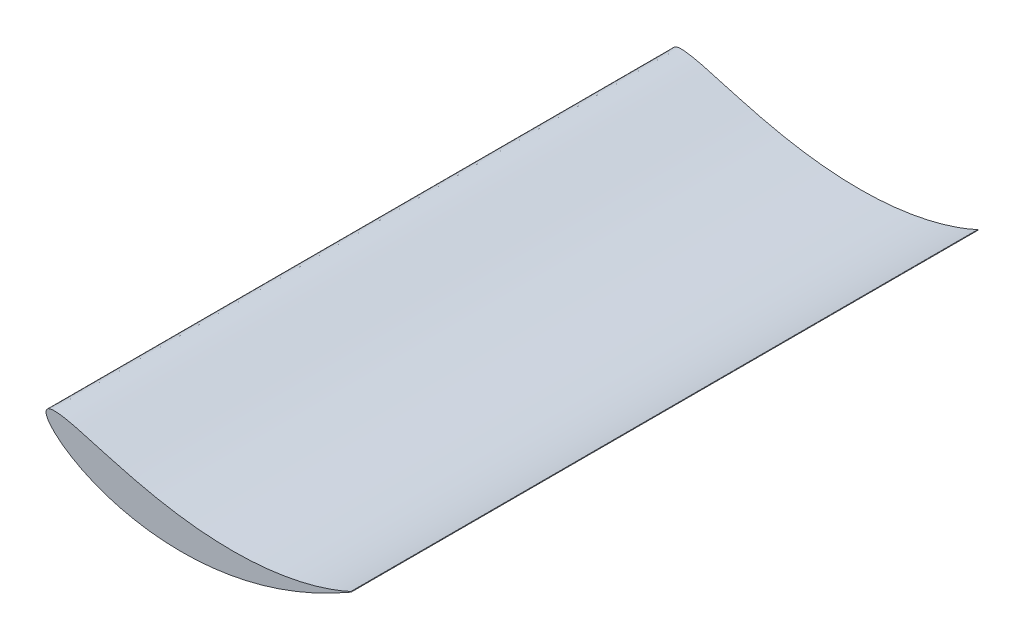
ISO-10303-21;
HEADER;
FILE_DESCRIPTION(('STEP AP214'),'2;1');
FILE_NAME('part.step','',(''),(''),'','','');
FILE_SCHEMA(('AUTOMOTIVE_DESIGN { 1 0 10303 214 1 1 1 1 }'));
ENDSEC;
DATA;
#1=APPLICATION_CONTEXT('core data for automotive mechanical design processes');
#2=APPLICATION_PROTOCOL_DEFINITION('international standard','automotive_design',2000,#1);
#3=PRODUCT_CONTEXT('',#1,'mechanical');
#4=PRODUCT('Part','Part','',(#3));
#5=PRODUCT_RELATED_PRODUCT_CATEGORY('part','',(#4));
#6=PRODUCT_DEFINITION_FORMATION('','',#4);
#7=PRODUCT_DEFINITION_CONTEXT('part definition',#1,'design');
#8=PRODUCT_DEFINITION('design','',#6,#7);
#9=PRODUCT_DEFINITION_SHAPE('','',#8);
#10=(LENGTH_UNIT() NAMED_UNIT(*) SI_UNIT(.MILLI.,.METRE.));
#11=(NAMED_UNIT(*) PLANE_ANGLE_UNIT() SI_UNIT($,.RADIAN.));
#12=(NAMED_UNIT(*) SI_UNIT($,.STERADIAN.) SOLID_ANGLE_UNIT());
#13=UNCERTAINTY_MEASURE_WITH_UNIT(LENGTH_MEASURE(1.E-05),#10,'distance_accuracy_value','');
#14=(GEOMETRIC_REPRESENTATION_CONTEXT(3) GLOBAL_UNCERTAINTY_ASSIGNED_CONTEXT((#13)) GLOBAL_UNIT_ASSIGNED_CONTEXT((#10,
#11,#12)) REPRESENTATION_CONTEXT('',''));
#15=CARTESIAN_POINT('',(0.,0.,0.));
#16=DIRECTION('',(0.,0.,1.));
#17=DIRECTION('',(1.,0.,0.));
#18=AXIS2_PLACEMENT_3D('',#15,#16,#17);
#19=CARTESIAN_POINT('',(486.657341354284,-6.73232449568993,500.));
#20=CARTESIAN_POINT('',(486.085638681294,-7.05680348140979,500.));
#21=CARTESIAN_POINT('',(482.737532209218,-8.95387427209619,500.));
#22=CARTESIAN_POINT('',(475.692175775413,-12.9113740538838,500.));
#23=CARTESIAN_POINT('',(465.027145931114,-18.7340131615038,500.));
#24=CARTESIAN_POINT('',(452.059119688572,-25.5368173283939,500.));
#25=CARTESIAN_POINT('',(436.74558820918,-33.140035794349,500.));
#26=CARTESIAN_POINT('',(418.9783977227,-41.3489407058622,500.));
#27=CARTESIAN_POINT('',(398.720874381825,-49.8868191352382,500.));
#28=CARTESIAN_POINT('',(375.984909337288,-58.4126273575192,500.));
#29=CARTESIAN_POINT('',(350.871366032306,-66.5322444836141,500.));
#30=CARTESIAN_POINT('',(323.583875557935,-73.8122456245418,500.));
#31=CARTESIAN_POINT('',(294.448930191669,-79.8099996961047,500.));
#32=CARTESIAN_POINT('',(263.923663214591,-84.1207838742424,500.));
#33=CARTESIAN_POINT('',(232.58501486208,-86.4089011753028,500.));
#34=CARTESIAN_POINT('',(201.106623035848,-86.4627416629794,500.));
#35=CARTESIAN_POINT('',(170.214216606922,-84.2175036977153,500.));
#36=CARTESIAN_POINT('',(140.633243180254,-79.7748473789358,500.));
#37=CARTESIAN_POINT('',(113.030669073292,-73.3945534800693,500.));
#38=CARTESIAN_POINT('',(87.9663754496497,-65.4661715394237,500.));
#39=CARTESIAN_POINT('',(65.8588729860493,-56.4635080818295,500.));
#40=CARTESIAN_POINT('',(46.9691625991499,-46.8982545596448,500.));
#41=CARTESIAN_POINT('',(31.4082417888103,-37.2673411786861,500.));
#42=CARTESIAN_POINT('',(19.1505168887566,-28.0132116816228,500.));
#43=CARTESIAN_POINT('',(10.0690106874353,-19.5081219609915,500.));
#44=CARTESIAN_POINT('',(3.93413252373642,-11.9907284597516,500.));
#45=CARTESIAN_POINT('',(0.503662153914369,-5.63165724811867,500.));
#46=CARTESIAN_POINT('',(-0.533679010473301,-0.172474999839041,500.));
#47=CARTESIAN_POINT('',(1.49267098129205,4.18744371053212,500.));
#48=CARTESIAN_POINT('',(5.89303070860225,6.45429719929839,500.));
#49=CARTESIAN_POINT('',(11.6824050058229,7.29776893000845,500.));
#50=CARTESIAN_POINT('',(19.0052913801901,7.07724169537183,500.));
#51=CARTESIAN_POINT('',(27.7479137716138,5.88281406408676,500.));
#52=CARTESIAN_POINT('',(37.8078611526807,3.84747010511402,500.));
#53=CARTESIAN_POINT('',(49.0567027221249,1.10037088987706,500.));
#54=CARTESIAN_POINT('',(61.3797770707308,-2.21739336570347,500.));
#55=CARTESIAN_POINT('',(74.6697699865232,-5.96578386166646,500.));
#56=CARTESIAN_POINT('',(88.827003182703,-10.0098803635091,500.));
#57=CARTESIAN_POINT('',(103.758452795069,-14.2197218251654,500.));
#58=CARTESIAN_POINT('',(119.375611208383,-18.4727035452283,500.));
#59=CARTESIAN_POINT('',(135.591799720459,-22.6598358800834,500.));
#60=CARTESIAN_POINT('',(152.323069564587,-26.6783296358737,500.));
#61=CARTESIAN_POINT('',(169.485806990319,-30.4386150912533,500.));
#62=CARTESIAN_POINT('',(186.996530714913,-33.8617313267654,500.));
#63=CARTESIAN_POINT('',(204.771850024994,-36.8792474203399,500.));
#64=CARTESIAN_POINT('',(222.727377843724,-39.4367491359906,500.));
#65=CARTESIAN_POINT('',(240.778620987225,-41.4875800193539,500.));
#66=CARTESIAN_POINT('',(258.840407224494,-42.999573286148,500.));
#67=CARTESIAN_POINT('',(276.827465415556,-43.9504040745449,500.));
#68=CARTESIAN_POINT('',(294.654613528847,-44.3291019318075,500.));
#69=CARTESIAN_POINT('',(312.237185774458,-44.135814737324,500.));
#70=CARTESIAN_POINT('',(329.490994921156,-43.3808014352712,500.));
#71=CARTESIAN_POINT('',(346.333229212155,-42.0858519188073,500.));
#72=CARTESIAN_POINT('',(362.682058467044,-40.2823228785514,500.));
#73=CARTESIAN_POINT('',(378.4579872314,-38.012145853454,500.));
#74=CARTESIAN_POINT('',(393.582947296008,-35.3249428271764,500.));
#75=CARTESIAN_POINT('',(407.981791280086,-32.2809590924514,500.));
#76=CARTESIAN_POINT('',(421.581250587012,-28.948698628889,500.));
#77=CARTESIAN_POINT('',(434.311550958499,-25.4059319646545,500.));
#78=CARTESIAN_POINT('',(446.103295612154,-21.7341121014104,500.));
#79=CARTESIAN_POINT('',(456.892120035844,-18.0261577598632,500.));
#80=CARTESIAN_POINT('',(466.611166099786,-14.3787178832474,500.));
#81=CARTESIAN_POINT('',(475.204808058758,-10.8903046353103,500.));
#82=CARTESIAN_POINT('',(481.625158416295,-8.10015455088709,500.));
#83=CARTESIAN_POINT('',(485.196628153214,-6.46638271164412,500.));
#84=CARTESIAN_POINT('',(486.29710745076,-5.95583887093947,500.));
#85=B_SPLINE_CURVE_WITH_KNOTS('',3,(#19,#20,#21,#22,#23,#24,#25,#26,#27,#28,#29,#30,#31,#32,#33,
#34,#35,#36,#37,#38,#39,#40,#41,#42,#43,#44,#45,#46,#47,#48,#49,#50,#51,#52,#53,#54,#55,#56,#57,
#58,#59,#60,#61,#62,#63,#64,#65,#66,#67,#68,#69,#70,#71,#72,#73,#74,#75,#76,#77,#78,#79,#80,#81,
#82,#83,#84),.UNSPECIFIED.,.F.,.F.,(4,1,1,1,1,1,1,1,1,1,1,1,1,1,1,1,1,1,1,1,1,1,1,1,1,1,1,1,1,1,
1,1,1,1,1,1,1,1,1,1,1,1,1,1,1,1,1,1,1,1,1,1,1,1,1,1,1,1,1,1,1,1,1,4),(0.0144575729543541,
0.016354527057599,0.0255892091094669,0.037067816404931,0.0508545016176155,0.0669850232537373,
0.0854578364560865,0.106225288239911,0.12917998384715,0.154148680118291,0.180883335079671,
0.209058051835446,0.238271881003164,0.268058237582787,0.297903876235442,0.327269841048481,
0.355623841618484,0.382465396579952,0.407355501459855,0.429934859408064,0.44993897241164,
0.467201510337176,0.481654743678724,0.493326475768122,0.502345383546677,0.508967218144621,
0.513683958526164,0.517466280768162,0.521650737101246,0.527066359245362,0.533951818546579,
0.542299609164813,0.552017630625205,0.562981800758078,0.575062674605368,0.58812908832469,
0.602056581828096,0.616727009192038,0.632028813514711,0.647858179931905,0.664118458358625,
0.680718253960307,0.697573163857051,0.714603084498674,0.731732437979172,0.748889668859815,
0.766005494621813,0.783014284870449,0.799851871116559,0.816455186450603,0.832763308706103,
0.848714237871263,0.864246916691086,0.879299021901587,0.893808281163375,0.907709696319397,
0.920937866660647,0.933423618359619,0.945096561860754,0.955881368680516,0.965700785345497,
0.974472497589234,0.982111552748718,0.98554088129266),.UNSPECIFIED.);
#86=DIRECTION('',(0.,0.,-1.));
#87=VECTOR('',#86,1.);
#88=SURFACE_OF_LINEAR_EXTRUSION('',#85,#87);
#89=CARTESIAN_POINT('',(486.657341354284,-6.73232449568993,-500.));
#90=CARTESIAN_POINT('',(486.085638681294,-7.05680348140979,-500.));
#91=CARTESIAN_POINT('',(482.737532209218,-8.95387427209619,-500.));
#92=CARTESIAN_POINT('',(475.692175775413,-12.9113740538838,-500.));
#93=CARTESIAN_POINT('',(465.027145931114,-18.7340131615038,-500.));
#94=CARTESIAN_POINT('',(452.059119688572,-25.5368173283939,-500.));
#95=CARTESIAN_POINT('',(436.74558820918,-33.140035794349,-500.));
#96=CARTESIAN_POINT('',(418.9783977227,-41.3489407058622,-500.));
#97=CARTESIAN_POINT('',(398.720874381825,-49.8868191352382,-500.));
#98=CARTESIAN_POINT('',(375.984909337288,-58.4126273575192,-500.));
#99=CARTESIAN_POINT('',(350.871366032306,-66.5322444836141,-500.));
#100=CARTESIAN_POINT('',(323.583875557935,-73.8122456245418,-500.));
#101=CARTESIAN_POINT('',(294.448930191669,-79.8099996961047,-500.));
#102=CARTESIAN_POINT('',(263.923663214591,-84.1207838742424,-500.));
#103=CARTESIAN_POINT('',(232.58501486208,-86.4089011753028,-500.));
#104=CARTESIAN_POINT('',(201.106623035848,-86.4627416629794,-500.));
#105=CARTESIAN_POINT('',(170.214216606922,-84.2175036977153,-500.));
#106=CARTESIAN_POINT('',(140.633243180254,-79.7748473789358,-500.));
#107=CARTESIAN_POINT('',(113.030669073292,-73.3945534800693,-500.));
#108=CARTESIAN_POINT('',(87.9663754496497,-65.4661715394237,-500.));
#109=CARTESIAN_POINT('',(65.8588729860493,-56.4635080818295,-500.));
#110=CARTESIAN_POINT('',(46.9691625991499,-46.8982545596448,-500.));
#111=CARTESIAN_POINT('',(31.4082417888103,-37.2673411786861,-500.));
#112=CARTESIAN_POINT('',(19.1505168887566,-28.0132116816228,-500.));
#113=CARTESIAN_POINT('',(10.0690106874353,-19.5081219609915,-500.));
#114=CARTESIAN_POINT('',(3.93413252373642,-11.9907284597516,-500.));
#115=CARTESIAN_POINT('',(0.503662153914369,-5.63165724811867,-500.));
#116=CARTESIAN_POINT('',(-0.533679010473301,-0.172474999839041,-500.));
#117=CARTESIAN_POINT('',(1.49267098129205,4.18744371053212,-500.));
#118=CARTESIAN_POINT('',(5.89303070860225,6.45429719929839,-500.));
#119=CARTESIAN_POINT('',(11.6824050058229,7.29776893000845,-500.));
#120=CARTESIAN_POINT('',(19.0052913801901,7.07724169537183,-500.));
#121=CARTESIAN_POINT('',(27.7479137716138,5.88281406408676,-500.));
#122=CARTESIAN_POINT('',(37.8078611526807,3.84747010511402,-500.));
#123=CARTESIAN_POINT('',(49.0567027221249,1.10037088987706,-500.));
#124=CARTESIAN_POINT('',(61.3797770707308,-2.21739336570347,-500.));
#125=CARTESIAN_POINT('',(74.6697699865232,-5.96578386166646,-500.));
#126=CARTESIAN_POINT('',(88.827003182703,-10.0098803635091,-500.));
#127=CARTESIAN_POINT('',(103.758452795069,-14.2197218251654,-500.));
#128=CARTESIAN_POINT('',(119.375611208383,-18.4727035452283,-500.));
#129=CARTESIAN_POINT('',(135.591799720459,-22.6598358800834,-500.));
#130=CARTESIAN_POINT('',(152.323069564587,-26.6783296358737,-500.));
#131=CARTESIAN_POINT('',(169.485806990319,-30.4386150912533,-500.));
#132=CARTESIAN_POINT('',(186.996530714913,-33.8617313267654,-500.));
#133=CARTESIAN_POINT('',(204.771850024994,-36.8792474203399,-500.));
#134=CARTESIAN_POINT('',(222.727377843724,-39.4367491359906,-500.));
#135=CARTESIAN_POINT('',(240.778620987225,-41.4875800193539,-500.));
#136=CARTESIAN_POINT('',(258.840407224494,-42.999573286148,-500.));
#137=CARTESIAN_POINT('',(276.827465415556,-43.9504040745449,-500.));
#138=CARTESIAN_POINT('',(294.654613528847,-44.3291019318075,-500.));
#139=CARTESIAN_POINT('',(312.237185774458,-44.135814737324,-500.));
#140=CARTESIAN_POINT('',(329.490994921156,-43.3808014352712,-500.));
#141=CARTESIAN_POINT('',(346.333229212155,-42.0858519188073,-500.));
#142=CARTESIAN_POINT('',(362.682058467044,-40.2823228785514,-500.));
#143=CARTESIAN_POINT('',(378.4579872314,-38.012145853454,-500.));
#144=CARTESIAN_POINT('',(393.582947296008,-35.3249428271764,-500.));
#145=CARTESIAN_POINT('',(407.981791280086,-32.2809590924514,-500.));
#146=CARTESIAN_POINT('',(421.581250587012,-28.948698628889,-500.));
#147=CARTESIAN_POINT('',(434.311550958499,-25.4059319646545,-500.));
#148=CARTESIAN_POINT('',(446.103295612154,-21.7341121014104,-500.));
#149=CARTESIAN_POINT('',(456.892120035844,-18.0261577598632,-500.));
#150=CARTESIAN_POINT('',(466.611166099786,-14.3787178832474,-500.));
#151=CARTESIAN_POINT('',(475.204808058758,-10.8903046353103,-500.));
#152=CARTESIAN_POINT('',(481.625158416295,-8.10015455088709,-500.));
#153=CARTESIAN_POINT('',(485.196628153214,-6.46638271164412,-500.));
#154=CARTESIAN_POINT('',(486.29710745076,-5.95583887093947,-500.));
#155=B_SPLINE_CURVE_WITH_KNOTS('',3,(#89,#90,#91,#92,#93,#94,#95,#96,#97,#98,#99,#100,#101,#102,
#103,#104,#105,#106,#107,#108,#109,#110,#111,#112,#113,#114,#115,#116,#117,#118,#119,#120,#121,
#122,#123,#124,#125,#126,#127,#128,#129,#130,#131,#132,#133,#134,#135,#136,#137,#138,#139,#140,
#141,#142,#143,#144,#145,#146,#147,#148,#149,#150,#151,#152,#153,#154),.UNSPECIFIED.,.F.,.F.,(4,
1,1,1,1,1,1,1,1,1,1,1,1,1,1,1,1,1,1,1,1,1,1,1,1,1,1,1,1,1,1,1,1,1,1,1,1,1,1,1,1,1,1,1,1,1,1,1,1,
1,1,1,1,1,1,1,1,1,1,1,1,1,1,4),(0.0144575729543541,0.016354527057599,0.0255892091094669,
0.037067816404931,0.0508545016176155,0.0669850232537373,0.0854578364560865,0.106225288239911,
0.12917998384715,0.154148680118291,0.180883335079671,0.209058051835446,0.238271881003164,
0.268058237582787,0.297903876235442,0.327269841048481,0.355623841618484,0.382465396579952,
0.407355501459855,0.429934859408064,0.44993897241164,0.467201510337176,0.481654743678724,
0.493326475768122,0.502345383546677,0.508967218144621,0.513683958526164,0.517466280768162,
0.521650737101246,0.527066359245362,0.533951818546579,0.542299609164813,0.552017630625205,
0.562981800758078,0.575062674605368,0.58812908832469,0.602056581828096,0.616727009192038,
0.632028813514711,0.647858179931905,0.664118458358625,0.680718253960307,0.697573163857051,
0.714603084498674,0.731732437979172,0.748889668859815,0.766005494621813,0.783014284870449,
0.799851871116559,0.816455186450603,0.832763308706103,0.848714237871263,0.864246916691086,
0.879299021901587,0.893808281163375,0.907709696319397,0.920937866660647,0.933423618359619,
0.945096561860754,0.955881368680516,0.965700785345497,0.974472497589234,0.982111552748718,
0.98554088129266),.UNSPECIFIED.);
#156=CARTESIAN_POINT('',(486.657341354284,-6.73232449568964,-500.));
#157=VERTEX_POINT('',#156);
#158=CARTESIAN_POINT('',(486.29710745076,-5.95583887093923,-500.));
#159=VERTEX_POINT('',#158);
#160=EDGE_CURVE('E62',#157,#159,#155,.T.);
#161=ORIENTED_EDGE('',*,*,#160,.F.);
#162=DIRECTION('',(0.,0.,-1.));
#163=VECTOR('',#162,1.);
#164=CARTESIAN_POINT('',(486.657341354284,-6.73232449568964,500.));
#165=LINE('',#164,#163);
#166=CARTESIAN_POINT('',(486.657341354284,-6.73232449568964,500.));
#167=VERTEX_POINT('',#166);
#168=EDGE_CURVE('E11',#167,#157,#165,.T.);
#169=ORIENTED_EDGE('',*,*,#168,.F.);
#170=CARTESIAN_POINT('',(486.29710745076,-5.95583887093923,500.));
#171=VERTEX_POINT('',#170);
#172=EDGE_CURVE('E66',#167,#171,#85,.T.);
#173=ORIENTED_EDGE('',*,*,#172,.T.);
#174=DIRECTION('',(0.,0.,-1.));
#175=VECTOR('',#174,1.);
#176=CARTESIAN_POINT('',(486.29710745076,-5.95583887093923,500.));
#177=LINE('',#176,#175);
#178=EDGE_CURVE('E36',#171,#159,#177,.T.);
#179=ORIENTED_EDGE('',*,*,#178,.T.);
#180=EDGE_LOOP('',(#161,#169,#173,#179));
#181=FACE_BOUND('',#180,.T.);
#182=ADVANCED_FACE('F32',(#181),#88,.T.);
#183=CARTESIAN_POINT('',(486.477224402526,-6.34408168331267,500.));
#184=DIRECTION('',(0.,0.,-1.));
#185=DIRECTION('',(-1.,0.,0.));
#186=AXIS2_PLACEMENT_3D('',#183,#184,#185);
#187=CYLINDRICAL_SURFACE('',#186,0.427989015832133);
#188=CARTESIAN_POINT('',(486.477224402526,-6.34408168331267,-500.));
#189=DIRECTION('',(0.,0.,-1.));
#190=DIRECTION('',(-1.,0.,0.));
#191=AXIS2_PLACEMENT_3D('',#188,#189,#190);
#192=CIRCLE('',#191,0.427989015832133);
#193=EDGE_CURVE('E59',#159,#157,#192,.T.);
#194=ORIENTED_EDGE('',*,*,#193,.F.);
#195=ORIENTED_EDGE('',*,*,#178,.F.);
#196=CARTESIAN_POINT('',(486.477224402526,-6.34408168331267,500.));
#197=DIRECTION('',(0.,0.,-1.));
#198=DIRECTION('',(-1.,0.,0.));
#199=AXIS2_PLACEMENT_3D('',#196,#197,#198);
#200=CIRCLE('',#199,0.427989015832133);
#201=EDGE_CURVE('E61',#171,#167,#200,.T.);
#202=ORIENTED_EDGE('',*,*,#201,.T.);
#203=ORIENTED_EDGE('',*,*,#168,.T.);
#204=EDGE_LOOP('',(#194,#195,#202,#203));
#205=FACE_BOUND('',#204,.T.);
#206=ADVANCED_FACE('F57',(#205),#187,.T.);
#207=CARTESIAN_POINT('',(5.09718589075669,-13.1876996063566,500.));
#208=DIRECTION('',(0.,0.,1.));
#209=DIRECTION('',(1.,0.,0.));
#210=AXIS2_PLACEMENT_3D('',#207,#208,#209);
#211=PLANE('',#210);
#212=ORIENTED_EDGE('',*,*,#172,.F.);
#213=ORIENTED_EDGE('',*,*,#201,.F.);
#214=EDGE_LOOP('',(#212,#213));
#215=FACE_BOUND('',#214,.T.);
#216=ADVANCED_FACE('F81',(#215),#211,.T.);
#217=CARTESIAN_POINT('',(5.09718589075669,-13.1876996063566,-500.));
#218=DIRECTION('',(0.,0.,1.));
#219=DIRECTION('',(1.,0.,0.));
#220=AXIS2_PLACEMENT_3D('',#217,#218,#219);
#221=PLANE('',#220);
#222=ORIENTED_EDGE('',*,*,#160,.T.);
#223=ORIENTED_EDGE('',*,*,#193,.T.);
#224=EDGE_LOOP('',(#222,#223));
#225=FACE_BOUND('',#224,.T.);
#226=ADVANCED_FACE('F65',(#225),#221,.F.);
#227=CLOSED_SHELL('',(#182,#206,#216,#226));
#228=MANIFOLD_SOLID_BREP('B2',#227);
#229=ADVANCED_BREP_SHAPE_REPRESENTATION('',(#18,#228),#14);
#230=SHAPE_DEFINITION_REPRESENTATION(#9,#229);
ENDSEC;
END-ISO-10303-21;
